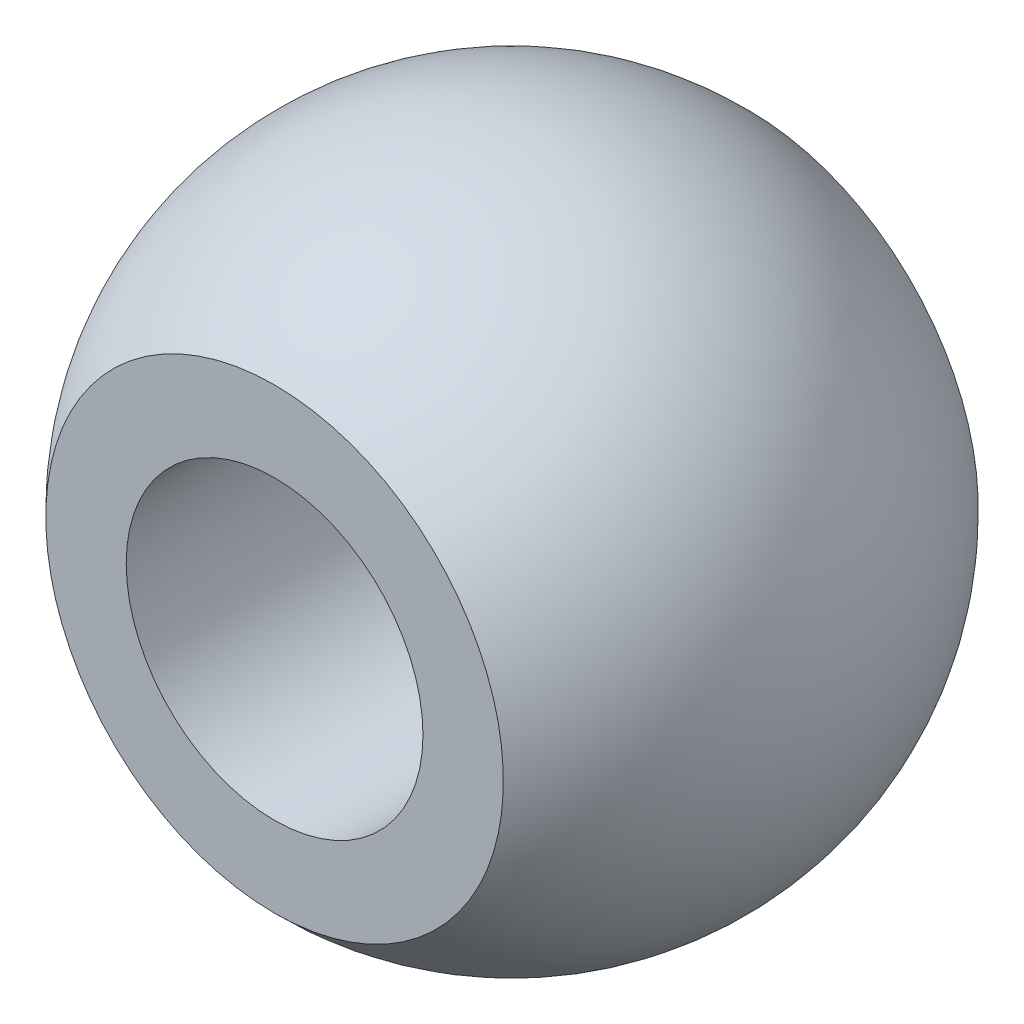
ISO-10303-21;
HEADER;
FILE_DESCRIPTION(('STEP AP214'),'2;1');
FILE_NAME('part.step','',(''),(''),'','','');
FILE_SCHEMA(('AUTOMOTIVE_DESIGN { 1 0 10303 214 1 1 1 1 }'));
ENDSEC;
DATA;
#1=APPLICATION_CONTEXT('core data for automotive mechanical design processes');
#2=APPLICATION_PROTOCOL_DEFINITION('international standard','automotive_design',2000,#1);
#3=PRODUCT_CONTEXT('',#1,'mechanical');
#4=PRODUCT('Part','Part','',(#3));
#5=PRODUCT_RELATED_PRODUCT_CATEGORY('part','',(#4));
#6=PRODUCT_DEFINITION_FORMATION('','',#4);
#7=PRODUCT_DEFINITION_CONTEXT('part definition',#1,'design');
#8=PRODUCT_DEFINITION('design','',#6,#7);
#9=PRODUCT_DEFINITION_SHAPE('','',#8);
#10=(LENGTH_UNIT() NAMED_UNIT(*) SI_UNIT(.MILLI.,.METRE.));
#11=(NAMED_UNIT(*) PLANE_ANGLE_UNIT() SI_UNIT($,.RADIAN.));
#12=(NAMED_UNIT(*) SI_UNIT($,.STERADIAN.) SOLID_ANGLE_UNIT());
#13=UNCERTAINTY_MEASURE_WITH_UNIT(LENGTH_MEASURE(1.E-05),#10,'distance_accuracy_value','');
#14=(GEOMETRIC_REPRESENTATION_CONTEXT(3) GLOBAL_UNCERTAINTY_ASSIGNED_CONTEXT((#13)) GLOBAL_UNIT_ASSIGNED_CONTEXT((#10,
#11,#12)) REPRESENTATION_CONTEXT('',''));
#15=CARTESIAN_POINT('',(0.,0.,0.));
#16=DIRECTION('',(0.,0.,1.));
#17=DIRECTION('',(1.,0.,0.));
#18=AXIS2_PLACEMENT_3D('',#15,#16,#17);
#19=CARTESIAN_POINT('',(0.,0.,0.));
#20=DIRECTION('',(0.,0.,1.));
#21=DIRECTION('',(0.,1.,0.));
#22=AXIS2_PLACEMENT_3D('',#19,#20,#21);
#23=SPHERICAL_SURFACE('',#22,5.555);
#24=CARTESIAN_POINT('',(0.,0.,4.));
#25=DIRECTION('',(0.,0.,1.));
#26=DIRECTION('',(1.,0.,0.));
#27=AXIS2_PLACEMENT_3D('',#24,#25,#26);
#28=CIRCLE('',#27,3.85461087530246);
#29=CARTESIAN_POINT('',(0.,3.85461087530246,4.));
#30=VERTEX_POINT('',#29);
#31=EDGE_CURVE('E10',#30,#30,#28,.T.);
#32=CARTESIAN_POINT('',(0.,0.,-4.));
#33=DIRECTION('',(0.,0.,1.));
#34=DIRECTION('',(1.,0.,0.));
#35=AXIS2_PLACEMENT_3D('',#32,#33,#34);
#36=CIRCLE('',#35,3.85461087530246);
#37=CARTESIAN_POINT('',(0.,3.85461087530246,-4.));
#38=VERTEX_POINT('',#37);
#39=EDGE_CURVE('E44',#38,#38,#36,.T.);
#40=CARTESIAN_POINT('',(0.,3.85461087530246,4.));
#41=CARTESIAN_POINT('',(0.,3.92160459176784,3.93544426188838));
#42=CARTESIAN_POINT('',(0.,3.98697348093006,3.86920267648272));
#43=CARTESIAN_POINT('',(0.,4.11430340097006,3.73352136709474));
#44=CARTESIAN_POINT('',(0.,4.17626443184785,3.66408164311243));
#45=CARTESIAN_POINT('',(0.,4.29662043164093,3.52217761258262));
#46=CARTESIAN_POINT('',(0.,4.35501540055622,3.44971330603513));
#47=CARTESIAN_POINT('',(0.,4.46809237797238,3.30194346311925));
#48=CARTESIAN_POINT('',(0.,4.52277438647326,3.22663792675087));
#49=CARTESIAN_POINT('',(0.,4.62828729836303,3.07337556849825));
#50=CARTESIAN_POINT('',(0.,4.67911820175192,2.99541874661401));
#51=CARTESIAN_POINT('',(0.,4.7768006441541,2.83705060861105));
#52=CARTESIAN_POINT('',(0.,4.82365218316738,2.75663929249234));
#53=CARTESIAN_POINT('',(0.,4.91325763690058,2.59356511069302));
#54=CARTESIAN_POINT('',(0.,4.95601155162049,2.51090224501242));
#55=CARTESIAN_POINT('',(0.,5.03731385089374,2.34353360269057));
#56=CARTESIAN_POINT('',(0.,5.07586223544707,2.25882782604932));
#57=CARTESIAN_POINT('',(0.,5.14865617984322,2.08758715360801));
#58=CARTESIAN_POINT('',(0.,5.18290173968603,2.00105225780794));
#59=CARTESIAN_POINT('',(0.,5.24700360104838,1.82637175624118));
#60=CARTESIAN_POINT('',(0.,5.27685990256793,1.7382261504745));
#61=CARTESIAN_POINT('',(0.,5.33210789167415,1.56054670329012));
#62=CARTESIAN_POINT('',(0.,5.35749957926082,1.47101286187244));
#63=CARTESIAN_POINT('',(0.,5.40375425337772,1.29078292158485));
#64=CARTESIAN_POINT('',(0.,5.42461723990795,1.20008682271495));
#65=CARTESIAN_POINT('',(0.,5.46176185494897,1.01776127917625));
#66=CARTESIAN_POINT('',(0.,5.47804348345976,0.926131834507459));
#67=CARTESIAN_POINT('',(0.,5.50598428858337,0.742170866738706));
#68=CARTESIAN_POINT('',(0.,5.5176434651962,0.649839343638747));
#69=CARTESIAN_POINT('',(0.,5.5363099394428,0.464707258379246));
#70=CARTESIAN_POINT('',(0.,5.54331723707658,0.371906696219705));
#71=CARTESIAN_POINT('',(0.,5.55266226735518,0.186070756040109));
#72=CARTESIAN_POINT('',(0.,5.555,0.0930353780200541));
#73=CARTESIAN_POINT('',(0.,5.555,-0.0930353780200553));
#74=CARTESIAN_POINT('',(0.,5.55266226735518,-0.18607075604011));
#75=CARTESIAN_POINT('',(0.,5.54331723707658,-0.371906696219706));
#76=CARTESIAN_POINT('',(0.,5.5363099394428,-0.464707258379248));
#77=CARTESIAN_POINT('',(0.,5.5176434651962,-0.649839343638748));
#78=CARTESIAN_POINT('',(0.,5.50598428858337,-0.742170866738707));
#79=CARTESIAN_POINT('',(0.,5.47804348345976,-0.92613183450746));
#80=CARTESIAN_POINT('',(0.,5.46176185494897,-1.01776127917626));
#81=CARTESIAN_POINT('',(0.,5.42461723990795,-1.20008682271495));
#82=CARTESIAN_POINT('',(0.,5.40375425337772,-1.29078292158485));
#83=CARTESIAN_POINT('',(0.,5.35749957926082,-1.47101286187244));
#84=CARTESIAN_POINT('',(0.,5.33210789167415,-1.56054670329012));
#85=CARTESIAN_POINT('',(0.,5.27685990256793,-1.7382261504745));
#86=CARTESIAN_POINT('',(0.,5.24700360104838,-1.82637175624118));
#87=CARTESIAN_POINT('',(0.,5.18290173968603,-2.00105225780794));
#88=CARTESIAN_POINT('',(0.,5.14865617984322,-2.08758715360801));
#89=CARTESIAN_POINT('',(0.,5.07586223544707,-2.25882782604933));
#90=CARTESIAN_POINT('',(0.,5.03731385089374,-2.34353360269057));
#91=CARTESIAN_POINT('',(0.,4.95601155162049,-2.51090224501242));
#92=CARTESIAN_POINT('',(0.,4.91325763690058,-2.59356511069302));
#93=CARTESIAN_POINT('',(0.,4.82365218316738,-2.75663929249234));
#94=CARTESIAN_POINT('',(0.,4.7768006441541,-2.83705060861105));
#95=CARTESIAN_POINT('',(0.,4.67911820175192,-2.99541874661401));
#96=CARTESIAN_POINT('',(0.,4.62828729836303,-3.07337556849825));
#97=CARTESIAN_POINT('',(0.,4.52277438647326,-3.22663792675087));
#98=CARTESIAN_POINT('',(0.,4.46809237797238,-3.30194346311925));
#99=CARTESIAN_POINT('',(0.,4.35501540055621,-3.44971330603513));
#100=CARTESIAN_POINT('',(0.,4.29662043164092,-3.52217761258262));
#101=CARTESIAN_POINT('',(0.,4.17626443184785,-3.66408164311243));
#102=CARTESIAN_POINT('',(0.,4.11430340097006,-3.73352136709474));
#103=CARTESIAN_POINT('',(0.,3.98697348093005,-3.86920267648272));
#104=CARTESIAN_POINT('',(0.,3.92160459176784,-3.93544426188838));
#105=CARTESIAN_POINT('',(0.,3.85461087530246,-4.));
#106=B_SPLINE_CURVE_WITH_KNOTS('',3,(#40,#41,#42,#43,#44,#45,#46,#47,#48,#49,#50,#51,#52,#53,
#54,#55,#56,#57,#58,#59,#60,#61,#62,#63,#64,#65,#66,#67,#68,#69,#70,#71,#72,#73,#74,#75,#76,#77,
#78,#79,#80,#81,#82,#83,#84,#85,#86,#87,#88,#89,#90,#91,#92,#93,#94,#95,#96,#97,#98,#99,#100,
#101,#102,#103,#104,#105),.UNSPECIFIED.,.F.,.F.,(4,2,2,2,2,2,2,2,2,2,2,2,2,2,2,2,2,2,2,2,2,2,2,
2,2,2,2,2,2,2,2,2,4),(0.,0.279076786712158,0.558153573424316,0.837230360136474,1.11630714684863,
1.39538393356079,1.67446072027295,1.95353750698511,2.23261429369726,2.51169108040942,
2.79076786712158,3.06984465383374,3.3489214405459,3.62799822725806,3.90707501397021,
4.18615180068237,4.46522858739453,4.74430537410669,5.02338216081885,5.302458947531,
5.58153573424316,5.86061252095532,6.13968930766748,6.41876609437964,6.69784288109179,
6.97691966780395,7.25599645451611,7.53507324122827,7.81415002794043,8.09322681465258,
8.37230360136474,8.6513803880769,8.93045717478906),.UNSPECIFIED.);
#107=EDGE_CURVE('BSEAM30',#30,#38,#106,.T.);
#108=ORIENTED_EDGE('',*,*,#31,.F.);
#109=ORIENTED_EDGE('',*,*,#39,.T.);
#110=ORIENTED_EDGE('',*,*,#107,.T.);
#111=ORIENTED_EDGE('',*,*,#107,.F.);
#112=EDGE_LOOP('',(#108,#110,#109,#111));
#113=FACE_BOUND('',#112,.T.);
#114=ADVANCED_FACE('F30',(#113),#23,.T.);
#115=CARTESIAN_POINT('',(0.,3.85461087530246,4.));
#116=DIRECTION('',(0.,0.,-1.));
#117=DIRECTION('',(-1.,0.,0.));
#118=AXIS2_PLACEMENT_3D('',#115,#116,#117);
#119=PLANE('',#118);
#120=CARTESIAN_POINT('',(0.,0.,4.));
#121=DIRECTION('',(0.,0.,1.));
#122=DIRECTION('',(1.,0.,0.));
#123=AXIS2_PLACEMENT_3D('',#120,#121,#122);
#124=CIRCLE('',#123,2.5);
#125=CARTESIAN_POINT('',(2.5,0.,4.));
#126=VERTEX_POINT('',#125);
#127=EDGE_CURVE('E36',#126,#126,#124,.T.);
#128=ORIENTED_EDGE('',*,*,#127,.F.);
#129=EDGE_LOOP('',(#128));
#130=FACE_BOUND('',#129,.T.);
#131=ORIENTED_EDGE('',*,*,#31,.T.);
#132=EDGE_LOOP('',(#131));
#133=FACE_BOUND('',#132,.T.);
#134=ADVANCED_FACE('F59',(#130,#133),#119,.F.);
#135=CARTESIAN_POINT('',(0.,0.,4.));
#136=DIRECTION('',(0.,0.,1.));
#137=DIRECTION('',(1.,0.,0.));
#138=AXIS2_PLACEMENT_3D('',#135,#136,#137);
#139=CYLINDRICAL_SURFACE('',#138,2.5);
#140=CARTESIAN_POINT('',(0.,0.,-4.));
#141=DIRECTION('',(0.,0.,1.));
#142=DIRECTION('',(1.,0.,0.));
#143=AXIS2_PLACEMENT_3D('',#140,#141,#142);
#144=CIRCLE('',#143,2.5);
#145=CARTESIAN_POINT('',(2.5,0.,-4.));
#146=VERTEX_POINT('',#145);
#147=EDGE_CURVE('E40',#146,#146,#144,.T.);
#148=ORIENTED_EDGE('',*,*,#147,.F.);
#149=EDGE_LOOP('',(#148));
#150=FACE_BOUND('',#149,.T.);
#151=ORIENTED_EDGE('',*,*,#127,.T.);
#152=EDGE_LOOP('',(#151));
#153=FACE_BOUND('',#152,.T.);
#154=ADVANCED_FACE('F54',(#150,#153),#139,.F.);
#155=CARTESIAN_POINT('',(0.,3.85461087530246,-4.));
#156=DIRECTION('',(0.,0.,1.));
#157=DIRECTION('',(1.,0.,0.));
#158=AXIS2_PLACEMENT_3D('',#155,#156,#157);
#159=PLANE('',#158);
#160=ORIENTED_EDGE('',*,*,#39,.F.);
#161=EDGE_LOOP('',(#160));
#162=FACE_BOUND('',#161,.T.);
#163=ORIENTED_EDGE('',*,*,#147,.T.);
#164=EDGE_LOOP('',(#163));
#165=FACE_BOUND('',#164,.T.);
#166=ADVANCED_FACE('F51',(#162,#165),#159,.F.);
#167=CLOSED_SHELL('',(#114,#134,#154,#166));
#168=MANIFOLD_SOLID_BREP('B2',#167);
#169=ADVANCED_BREP_SHAPE_REPRESENTATION('',(#18,#168),#14);
#170=SHAPE_DEFINITION_REPRESENTATION(#9,#169);
ENDSEC;
END-ISO-10303-21;
